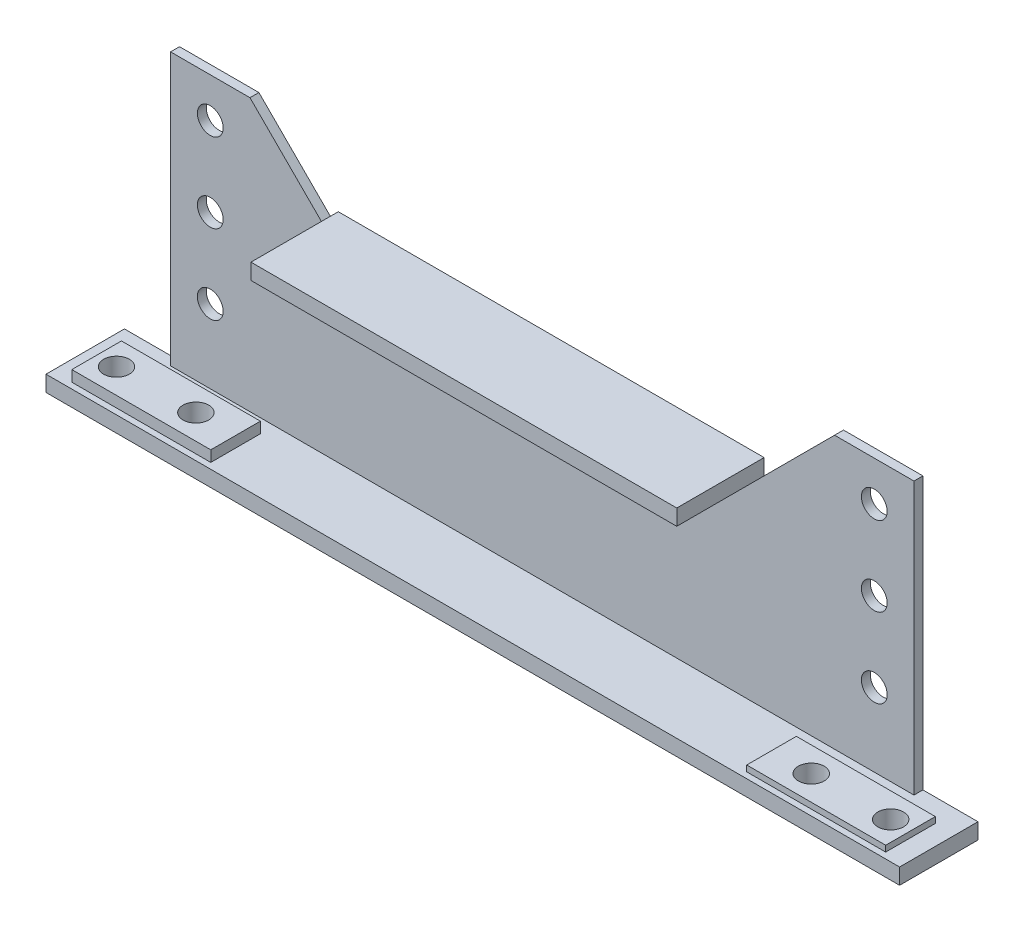
ISO-10303-21;
HEADER;
FILE_DESCRIPTION(('STEP AP214'),'2;1');
FILE_NAME('part.step','',(''),(''),'','','');
FILE_SCHEMA(('AUTOMOTIVE_DESIGN { 1 0 10303 214 1 1 1 1 }'));
ENDSEC;
DATA;
#1=APPLICATION_CONTEXT('core data for automotive mechanical design processes');
#2=APPLICATION_PROTOCOL_DEFINITION('international standard','automotive_design',2000,#1);
#3=PRODUCT_CONTEXT('',#1,'mechanical');
#4=PRODUCT('Part','Part','',(#3));
#5=PRODUCT_RELATED_PRODUCT_CATEGORY('part','',(#4));
#6=PRODUCT_DEFINITION_FORMATION('','',#4);
#7=PRODUCT_DEFINITION_CONTEXT('part definition',#1,'design');
#8=PRODUCT_DEFINITION('design','',#6,#7);
#9=PRODUCT_DEFINITION_SHAPE('','',#8);
#10=(LENGTH_UNIT() NAMED_UNIT(*) SI_UNIT(.MILLI.,.METRE.));
#11=(NAMED_UNIT(*) PLANE_ANGLE_UNIT() SI_UNIT($,.RADIAN.));
#12=(NAMED_UNIT(*) SI_UNIT($,.STERADIAN.) SOLID_ANGLE_UNIT());
#13=UNCERTAINTY_MEASURE_WITH_UNIT(LENGTH_MEASURE(1.E-05),#10,'distance_accuracy_value','');
#14=(GEOMETRIC_REPRESENTATION_CONTEXT(3) GLOBAL_UNCERTAINTY_ASSIGNED_CONTEXT((#13)) GLOBAL_UNIT_ASSIGNED_CONTEXT((#10,
#11,#12)) REPRESENTATION_CONTEXT('',''));
#15=CARTESIAN_POINT('',(0.,0.,0.));
#16=DIRECTION('',(0.,0.,1.));
#17=DIRECTION('',(1.,0.,0.));
#18=AXIS2_PLACEMENT_3D('',#15,#16,#17);
#19=CARTESIAN_POINT('',(0.,15.9999999999956,9.));
#20=DIRECTION('',(0.,0.,-1.));
#21=DIRECTION('',(-1.,0.,0.));
#22=AXIS2_PLACEMENT_3D('',#19,#20,#21);
#23=PLANE('',#22);
#24=CARTESIAN_POINT('',(764.499999999999,169.999999999994,9.));
#25=DIRECTION('',(0.,0.,1.));
#26=DIRECTION('',(1.,0.,0.));
#27=AXIS2_PLACEMENT_3D('',#24,#25,#26);
#28=CIRCLE('',#27,13.);
#29=CARTESIAN_POINT('',(777.499999999999,169.999999999994,9.));
#30=VERTEX_POINT('',#29);
#31=EDGE_CURVE('E325',#30,#30,#28,.T.);
#32=ORIENTED_EDGE('',*,*,#31,.F.);
#33=EDGE_LOOP('',(#32));
#34=FACE_BOUND('',#33,.T.);
#35=CARTESIAN_POINT('',(95.4999999999935,250.,9.));
#36=DIRECTION('',(0.,0.,1.));
#37=DIRECTION('',(1.,0.,0.));
#38=AXIS2_PLACEMENT_3D('',#35,#36,#37);
#39=CIRCLE('',#38,13.);
#40=CARTESIAN_POINT('',(108.499999999994,250.,9.));
#41=VERTEX_POINT('',#40);
#42=EDGE_CURVE('E337',#41,#41,#39,.T.);
#43=ORIENTED_EDGE('',*,*,#42,.F.);
#44=EDGE_LOOP('',(#43));
#45=FACE_BOUND('',#44,.T.);
#46=CARTESIAN_POINT('',(95.4999999999935,90.0000000000017,9.));
#47=DIRECTION('',(0.,0.,1.));
#48=DIRECTION('',(1.,0.,0.));
#49=AXIS2_PLACEMENT_3D('',#46,#47,#48);
#50=CIRCLE('',#49,13.);
#51=CARTESIAN_POINT('',(108.499999999994,90.0000000000017,9.));
#52=VERTEX_POINT('',#51);
#53=EDGE_CURVE('E349',#52,#52,#50,.T.);
#54=ORIENTED_EDGE('',*,*,#53,.F.);
#55=EDGE_LOOP('',(#54));
#56=FACE_BOUND('',#55,.T.);
#57=CARTESIAN_POINT('',(95.4999999999935,169.999999999994,9.));
#58=DIRECTION('',(0.,0.,1.));
#59=DIRECTION('',(1.,0.,0.));
#60=AXIS2_PLACEMENT_3D('',#57,#58,#59);
#61=CIRCLE('',#60,13.);
#62=CARTESIAN_POINT('',(108.499999999994,169.999999999994,9.));
#63=VERTEX_POINT('',#62);
#64=EDGE_CURVE('E343',#63,#63,#61,.T.);
#65=ORIENTED_EDGE('',*,*,#64,.F.);
#66=EDGE_LOOP('',(#65));
#67=FACE_BOUND('',#66,.T.);
#68=CARTESIAN_POINT('',(764.499999999999,90.0000000000017,9.));
#69=DIRECTION('',(0.,0.,1.));
#70=DIRECTION('',(1.,0.,0.));
#71=AXIS2_PLACEMENT_3D('',#68,#69,#70);
#72=CIRCLE('',#71,13.);
#73=CARTESIAN_POINT('',(777.499999999999,90.0000000000017,9.));
#74=VERTEX_POINT('',#73);
#75=EDGE_CURVE('E331',#74,#74,#72,.T.);
#76=ORIENTED_EDGE('',*,*,#75,.F.);
#77=EDGE_LOOP('',(#76));
#78=FACE_BOUND('',#77,.T.);
#79=CARTESIAN_POINT('',(764.499999999999,250.,9.));
#80=DIRECTION('',(0.,0.,1.));
#81=DIRECTION('',(1.,0.,0.));
#82=AXIS2_PLACEMENT_3D('',#79,#80,#81);
#83=CIRCLE('',#82,13.);
#84=CARTESIAN_POINT('',(777.499999999999,250.,9.));
#85=VERTEX_POINT('',#84);
#86=EDGE_CURVE('E319',#85,#85,#83,.T.);
#87=ORIENTED_EDGE('',*,*,#86,.F.);
#88=EDGE_LOOP('',(#87));
#89=FACE_BOUND('',#88,.T.);
#90=DIRECTION('',(1.,0.,0.));
#91=VECTOR('',#90,1.);
#92=CARTESIAN_POINT('',(215.5,210.,9.));
#93=LINE('',#92,#91);
#94=CARTESIAN_POINT('',(215.5,210.,9.));
#95=VERTEX_POINT('',#94);
#96=CARTESIAN_POINT('',(644.50000000001,210.,9.));
#97=VERTEX_POINT('',#96);
#98=EDGE_CURVE('E210',#95,#97,#93,.T.);
#99=ORIENTED_EDGE('',*,*,#98,.F.);
#100=DIRECTION('',(-0.707106781186546,0.707106781186549,0.));
#101=VECTOR('',#100,1.);
#102=CARTESIAN_POINT('',(135.5,290.,9.));
#103=LINE('',#102,#101);
#104=CARTESIAN_POINT('',(135.5,290.,9.));
#105=VERTEX_POINT('',#104);
#106=EDGE_CURVE('E360',#95,#105,#103,.T.);
#107=ORIENTED_EDGE('',*,*,#106,.T.);
#108=DIRECTION('',(-1.,0.,0.));
#109=VECTOR('',#108,1.);
#110=CARTESIAN_POINT('',(55.4999999999975,289.999999999996,9.));
#111=LINE('',#110,#109);
#112=CARTESIAN_POINT('',(55.4999999999975,289.999999999996,9.));
#113=VERTEX_POINT('',#112);
#114=EDGE_CURVE('E362',#105,#113,#111,.T.);
#115=ORIENTED_EDGE('',*,*,#114,.T.);
#116=DIRECTION('',(0.,-1.,0.));
#117=VECTOR('',#116,1.);
#118=CARTESIAN_POINT('',(55.4999999999975,15.9999999999956,9.));
#119=LINE('',#118,#117);
#120=CARTESIAN_POINT('',(55.4999999999975,15.9999999999956,9.));
#121=VERTEX_POINT('',#120);
#122=EDGE_CURVE('E364',#113,#121,#119,.T.);
#123=ORIENTED_EDGE('',*,*,#122,.T.);
#124=DIRECTION('',(-1.,0.,0.));
#125=VECTOR('',#124,1.);
#126=CARTESIAN_POINT('',(0.,15.9999999999956,9.));
#127=LINE('',#126,#125);
#128=CARTESIAN_POINT('',(804.499999999995,15.9999999999956,9.));
#129=VERTEX_POINT('',#128);
#130=EDGE_CURVE('E11',#129,#121,#127,.T.);
#131=ORIENTED_EDGE('',*,*,#130,.F.);
#132=DIRECTION('',(0.,1.,0.));
#133=VECTOR('',#132,1.);
#134=CARTESIAN_POINT('',(804.499999999995,15.9999999999956,9.));
#135=LINE('',#134,#133);
#136=CARTESIAN_POINT('',(804.499999999995,289.999999999996,9.));
#137=VERTEX_POINT('',#136);
#138=EDGE_CURVE('E358',#129,#137,#135,.T.);
#139=ORIENTED_EDGE('',*,*,#138,.T.);
#140=DIRECTION('',(-1.,0.,0.));
#141=VECTOR('',#140,1.);
#142=CARTESIAN_POINT('',(804.499999999995,289.999999999996,9.));
#143=LINE('',#142,#141);
#144=CARTESIAN_POINT('',(724.5,290.,9.));
#145=VERTEX_POINT('',#144);
#146=EDGE_CURVE('E355',#137,#145,#143,.T.);
#147=ORIENTED_EDGE('',*,*,#146,.T.);
#148=DIRECTION('',(-0.707106781186501,-0.707106781186594,0.));
#149=VECTOR('',#148,1.);
#150=CARTESIAN_POINT('',(724.5,290.,9.));
#151=LINE('',#150,#149);
#152=EDGE_CURVE('E357',#145,#97,#151,.T.);
#153=ORIENTED_EDGE('',*,*,#152,.T.);
#154=EDGE_LOOP('',(#99,#107,#115,#123,#131,#139,#147,#153));
#155=FACE_BOUND('',#154,.T.);
#156=ADVANCED_FACE('F34',(#34,#45,#56,#67,#78,#89,#155),#23,.F.);
#157=CARTESIAN_POINT('',(0.,15.9999999999956,9.));
#158=DIRECTION('',(0.,-1.,0.));
#159=DIRECTION('',(0.,0.,-1.));
#160=AXIS2_PLACEMENT_3D('',#157,#158,#159);
#161=PLANE('',#160);
#162=DIRECTION('',(-1.02487462960706E-13,0.,1.));
#163=VECTOR('',#162,1.);
#164=CARTESIAN_POINT('',(20.0000000000051,15.9999999999956,22.9999999999981));
#165=LINE('',#164,#163);
#166=CARTESIAN_POINT('',(20.0000000000051,15.9999999999956,22.9999999999981));
#167=VERTEX_POINT('',#166);
#168=CARTESIAN_POINT('',(20.,15.9999999999956,73.));
#169=VERTEX_POINT('',#168);
#170=EDGE_CURVE('E271',#167,#169,#165,.T.);
#171=ORIENTED_EDGE('',*,*,#170,.F.);
#172=DIRECTION('',(-1.,0.,0.));
#173=VECTOR('',#172,1.);
#174=CARTESIAN_POINT('',(20.0000000000051,15.9999999999956,22.9999999999981));
#175=LINE('',#174,#173);
#176=CARTESIAN_POINT('',(160.,15.9999999999956,23.));
#177=VERTEX_POINT('',#176);
#178=EDGE_CURVE('E278',#177,#167,#175,.T.);
#179=ORIENTED_EDGE('',*,*,#178,.F.);
#180=DIRECTION('',(0.,0.,-1.));
#181=VECTOR('',#180,1.);
#182=CARTESIAN_POINT('',(160.,15.9999999999956,23.));
#183=LINE('',#182,#181);
#184=CARTESIAN_POINT('',(160.,15.9999999999956,73.));
#185=VERTEX_POINT('',#184);
#186=EDGE_CURVE('E290',#185,#177,#183,.T.);
#187=ORIENTED_EDGE('',*,*,#186,.F.);
#188=DIRECTION('',(1.,0.,0.));
#189=VECTOR('',#188,1.);
#190=CARTESIAN_POINT('',(20.,15.9999999999956,73.));
#191=LINE('',#190,#189);
#192=EDGE_CURVE('E287',#169,#185,#191,.T.);
#193=ORIENTED_EDGE('',*,*,#192,.F.);
#194=EDGE_LOOP('',(#171,#179,#187,#193));
#195=FACE_BOUND('',#194,.T.);
#196=DIRECTION('',(-1.,0.,0.));
#197=VECTOR('',#196,1.);
#198=CARTESIAN_POINT('',(0.,15.9999999999956,0.));
#199=LINE('',#198,#197);
#200=CARTESIAN_POINT('',(55.4999999999975,15.9999999999956,0.));
#201=VERTEX_POINT('',#200);
#202=CARTESIAN_POINT('',(0.,15.9999999999956,0.));
#203=VERTEX_POINT('',#202);
#204=EDGE_CURVE('E391',#201,#203,#199,.T.);
#205=ORIENTED_EDGE('',*,*,#204,.T.);
#206=DIRECTION('',(0.,0.,-1.));
#207=VECTOR('',#206,1.);
#208=CARTESIAN_POINT('',(0.,15.9999999999956,9.));
#209=LINE('',#208,#207);
#210=CARTESIAN_POINT('',(0.,15.9999999999956,79.));
#211=VERTEX_POINT('',#210);
#212=EDGE_CURVE('E393',#211,#203,#209,.T.);
#213=ORIENTED_EDGE('',*,*,#212,.F.);
#214=DIRECTION('',(-1.,0.,0.));
#215=VECTOR('',#214,1.);
#216=CARTESIAN_POINT('',(0.,15.9999999999956,79.));
#217=LINE('',#216,#215);
#218=CARTESIAN_POINT('',(859.999999999992,15.9999999999956,79.));
#219=VERTEX_POINT('',#218);
#220=EDGE_CURVE('E315',#219,#211,#217,.T.);
#221=ORIENTED_EDGE('',*,*,#220,.F.);
#222=DIRECTION('',(0.,0.,-1.));
#223=VECTOR('',#222,1.);
#224=CARTESIAN_POINT('',(859.999999999992,15.9999999999956,9.));
#225=LINE('',#224,#223);
#226=CARTESIAN_POINT('',(859.999999999992,15.9999999999956,0.));
#227=VERTEX_POINT('',#226);
#228=EDGE_CURVE('E419',#219,#227,#225,.T.);
#229=ORIENTED_EDGE('',*,*,#228,.T.);
#230=DIRECTION('',(-1.,0.,0.));
#231=VECTOR('',#230,1.);
#232=CARTESIAN_POINT('',(859.999999999992,15.9999999999956,0.));
#233=LINE('',#232,#231);
#234=CARTESIAN_POINT('',(804.499999999995,15.9999999999956,0.));
#235=VERTEX_POINT('',#234);
#236=EDGE_CURVE('E371',#227,#235,#233,.T.);
#237=ORIENTED_EDGE('',*,*,#236,.T.);
#238=DIRECTION('',(0.,0.,-1.));
#239=VECTOR('',#238,1.);
#240=CARTESIAN_POINT('',(804.499999999995,15.9999999999956,9.));
#241=LINE('',#240,#239);
#242=EDGE_CURVE('E418',#129,#235,#241,.T.);
#243=ORIENTED_EDGE('',*,*,#242,.F.);
#244=ORIENTED_EDGE('',*,*,#130,.T.);
#245=DIRECTION('',(0.,0.,-1.));
#246=VECTOR('',#245,1.);
#247=CARTESIAN_POINT('',(55.4999999999975,15.9999999999956,9.));
#248=LINE('',#247,#246);
#249=EDGE_CURVE('E396',#121,#201,#248,.T.);
#250=ORIENTED_EDGE('',*,*,#249,.T.);
#251=EDGE_LOOP('',(#205,#213,#221,#229,#237,#243,#244,#250));
#252=FACE_BOUND('',#251,.T.);
#253=DIRECTION('',(1.06581410364011E-13,0.,-1.));
#254=VECTOR('',#253,1.);
#255=CARTESIAN_POINT('',(839.999999999998,15.9999999999956,22.9999999999981));
#256=LINE('',#255,#254);
#257=CARTESIAN_POINT('',(839.999999999993,15.9999999999956,73.));
#258=VERTEX_POINT('',#257);
#259=CARTESIAN_POINT('',(839.999999999998,15.9999999999956,22.9999999999981));
#260=VERTEX_POINT('',#259);
#261=EDGE_CURVE('E231',#258,#260,#256,.T.);
#262=ORIENTED_EDGE('',*,*,#261,.F.);
#263=DIRECTION('',(1.,0.,0.));
#264=VECTOR('',#263,1.);
#265=CARTESIAN_POINT('',(839.999999999993,15.9999999999956,73.));
#266=LINE('',#265,#264);
#267=CARTESIAN_POINT('',(699.999999999993,15.9999999999956,73.));
#268=VERTEX_POINT('',#267);
#269=EDGE_CURVE('E238',#268,#258,#266,.T.);
#270=ORIENTED_EDGE('',*,*,#269,.F.);
#271=DIRECTION('',(0.,0.,1.));
#272=VECTOR('',#271,1.);
#273=CARTESIAN_POINT('',(699.999999999992,15.9999999999956,23.));
#274=LINE('',#273,#272);
#275=CARTESIAN_POINT('',(699.999999999992,15.9999999999956,23.));
#276=VERTEX_POINT('',#275);
#277=EDGE_CURVE('E56',#276,#268,#274,.T.);
#278=ORIENTED_EDGE('',*,*,#277,.F.);
#279=DIRECTION('',(-1.,0.,0.));
#280=VECTOR('',#279,1.);
#281=CARTESIAN_POINT('',(839.999999999998,15.9999999999956,22.9999999999981));
#282=LINE('',#281,#280);
#283=EDGE_CURVE('E51',#260,#276,#282,.T.);
#284=ORIENTED_EDGE('',*,*,#283,.F.);
#285=EDGE_LOOP('',(#262,#270,#278,#284));
#286=FACE_BOUND('',#285,.T.);
#287=ADVANCED_FACE('F484',(#195,#252,#286),#161,.F.);
#288=CARTESIAN_POINT('',(0.,15.9999999999956,0.));
#289=DIRECTION('',(0.,0.,-1.));
#290=DIRECTION('',(-1.,0.,0.));
#291=AXIS2_PLACEMENT_3D('',#288,#289,#290);
#292=PLANE('',#291);
#293=CARTESIAN_POINT('',(764.499999999999,169.999999999994,0.));
#294=DIRECTION('',(0.,0.,1.));
#295=DIRECTION('',(1.,0.,0.));
#296=AXIS2_PLACEMENT_3D('',#293,#294,#295);
#297=CIRCLE('',#296,13.);
#298=CARTESIAN_POINT('',(777.499999999999,169.999999999994,0.));
#299=VERTEX_POINT('',#298);
#300=EDGE_CURVE('E322',#299,#299,#297,.T.);
#301=ORIENTED_EDGE('',*,*,#300,.T.);
#302=EDGE_LOOP('',(#301));
#303=FACE_BOUND('',#302,.T.);
#304=CARTESIAN_POINT('',(95.4999999999935,250.,0.));
#305=DIRECTION('',(0.,0.,1.));
#306=DIRECTION('',(1.,0.,0.));
#307=AXIS2_PLACEMENT_3D('',#304,#305,#306);
#308=CIRCLE('',#307,13.);
#309=CARTESIAN_POINT('',(108.499999999994,250.,0.));
#310=VERTEX_POINT('',#309);
#311=EDGE_CURVE('E334',#310,#310,#308,.T.);
#312=ORIENTED_EDGE('',*,*,#311,.T.);
#313=EDGE_LOOP('',(#312));
#314=FACE_BOUND('',#313,.T.);
#315=CARTESIAN_POINT('',(95.4999999999935,90.0000000000017,0.));
#316=DIRECTION('',(0.,0.,1.));
#317=DIRECTION('',(1.,0.,0.));
#318=AXIS2_PLACEMENT_3D('',#315,#316,#317);
#319=CIRCLE('',#318,13.);
#320=CARTESIAN_POINT('',(108.499999999994,90.0000000000017,0.));
#321=VERTEX_POINT('',#320);
#322=EDGE_CURVE('E346',#321,#321,#319,.T.);
#323=ORIENTED_EDGE('',*,*,#322,.T.);
#324=EDGE_LOOP('',(#323));
#325=FACE_BOUND('',#324,.T.);
#326=DIRECTION('',(0.,-1.,0.));
#327=VECTOR('',#326,1.);
#328=CARTESIAN_POINT('',(0.,0.,0.));
#329=LINE('',#328,#327);
#330=CARTESIAN_POINT('',(0.,0.,0.));
#331=VERTEX_POINT('',#330);
#332=EDGE_CURVE('E352',#203,#331,#329,.T.);
#333=ORIENTED_EDGE('',*,*,#332,.F.);
#334=ORIENTED_EDGE('',*,*,#204,.F.);
#335=DIRECTION('',(0.,-1.,0.));
#336=VECTOR('',#335,1.);
#337=CARTESIAN_POINT('',(55.4999999999975,15.9999999999956,0.));
#338=LINE('',#337,#336);
#339=CARTESIAN_POINT('',(55.4999999999975,289.999999999996,0.));
#340=VERTEX_POINT('',#339);
#341=EDGE_CURVE('E389',#340,#201,#338,.T.);
#342=ORIENTED_EDGE('',*,*,#341,.F.);
#343=DIRECTION('',(-1.,0.,0.));
#344=VECTOR('',#343,1.);
#345=CARTESIAN_POINT('',(55.4999999999975,289.999999999996,0.));
#346=LINE('',#345,#344);
#347=CARTESIAN_POINT('',(135.5,290.,0.));
#348=VERTEX_POINT('',#347);
#349=EDGE_CURVE('E387',#348,#340,#346,.T.);
#350=ORIENTED_EDGE('',*,*,#349,.F.);
#351=DIRECTION('',(-0.707106781186546,0.707106781186549,0.));
#352=VECTOR('',#351,1.);
#353=CARTESIAN_POINT('',(135.5,290.,0.));
#354=LINE('',#353,#352);
#355=CARTESIAN_POINT('',(215.5,210.,0.));
#356=VERTEX_POINT('',#355);
#357=EDGE_CURVE('E385',#356,#348,#354,.T.);
#358=ORIENTED_EDGE('',*,*,#357,.F.);
#359=DIRECTION('',(0.,-1.,0.));
#360=VECTOR('',#359,1.);
#361=CARTESIAN_POINT('',(215.5,210.,0.));
#362=LINE('',#361,#360);
#363=CARTESIAN_POINT('',(215.5,226.,0.));
#364=VERTEX_POINT('',#363);
#365=EDGE_CURVE('E383',#364,#356,#362,.T.);
#366=ORIENTED_EDGE('',*,*,#365,.F.);
#367=DIRECTION('',(-1.,0.,0.));
#368=VECTOR('',#367,1.);
#369=CARTESIAN_POINT('',(215.5,226.,0.));
#370=LINE('',#369,#368);
#371=CARTESIAN_POINT('',(644.50000000001,226.,0.));
#372=VERTEX_POINT('',#371);
#373=EDGE_CURVE('E381',#372,#364,#370,.T.);
#374=ORIENTED_EDGE('',*,*,#373,.F.);
#375=DIRECTION('',(0.,1.,0.));
#376=VECTOR('',#375,1.);
#377=CARTESIAN_POINT('',(644.50000000001,210.,0.));
#378=LINE('',#377,#376);
#379=CARTESIAN_POINT('',(644.50000000001,210.,0.));
#380=VERTEX_POINT('',#379);
#381=EDGE_CURVE('E379',#380,#372,#378,.T.);
#382=ORIENTED_EDGE('',*,*,#381,.F.);
#383=DIRECTION('',(-0.707106781186501,-0.707106781186594,0.));
#384=VECTOR('',#383,1.);
#385=CARTESIAN_POINT('',(724.5,290.,0.));
#386=LINE('',#385,#384);
#387=CARTESIAN_POINT('',(724.5,290.,0.));
#388=VERTEX_POINT('',#387);
#389=EDGE_CURVE('E377',#388,#380,#386,.T.);
#390=ORIENTED_EDGE('',*,*,#389,.F.);
#391=DIRECTION('',(-1.,0.,0.));
#392=VECTOR('',#391,1.);
#393=CARTESIAN_POINT('',(804.499999999995,289.999999999996,0.));
#394=LINE('',#393,#392);
#395=CARTESIAN_POINT('',(804.499999999995,289.999999999996,0.));
#396=VERTEX_POINT('',#395);
#397=EDGE_CURVE('E375',#396,#388,#394,.T.);
#398=ORIENTED_EDGE('',*,*,#397,.F.);
#399=DIRECTION('',(0.,1.,0.));
#400=VECTOR('',#399,1.);
#401=CARTESIAN_POINT('',(804.499999999995,15.9999999999956,0.));
#402=LINE('',#401,#400);
#403=EDGE_CURVE('E373',#235,#396,#402,.T.);
#404=ORIENTED_EDGE('',*,*,#403,.F.);
#405=ORIENTED_EDGE('',*,*,#236,.F.);
#406=DIRECTION('',(-4.64905891561913E-13,1.,0.));
#407=VECTOR('',#406,1.);
#408=CARTESIAN_POINT('',(860.,0.,0.));
#409=LINE('',#408,#407);
#410=CARTESIAN_POINT('',(860.,0.,0.));
#411=VERTEX_POINT('',#410);
#412=EDGE_CURVE('E369',#411,#227,#409,.T.);
#413=ORIENTED_EDGE('',*,*,#412,.F.);
#414=DIRECTION('',(1.,0.,0.));
#415=VECTOR('',#414,1.);
#416=CARTESIAN_POINT('',(0.,0.,0.));
#417=LINE('',#416,#415);
#418=EDGE_CURVE('E367',#331,#411,#417,.T.);
#419=ORIENTED_EDGE('',*,*,#418,.F.);
#420=EDGE_LOOP('',(#333,#334,#342,#350,#358,#366,#374,#382,#390,#398,#404,#405,#413,#419));
#421=FACE_BOUND('',#420,.T.);
#422=CARTESIAN_POINT('',(95.4999999999935,169.999999999994,0.));
#423=DIRECTION('',(0.,0.,1.));
#424=DIRECTION('',(1.,0.,0.));
#425=AXIS2_PLACEMENT_3D('',#422,#423,#424);
#426=CIRCLE('',#425,13.);
#427=CARTESIAN_POINT('',(108.499999999994,169.999999999994,0.));
#428=VERTEX_POINT('',#427);
#429=EDGE_CURVE('E340',#428,#428,#426,.T.);
#430=ORIENTED_EDGE('',*,*,#429,.T.);
#431=EDGE_LOOP('',(#430));
#432=FACE_BOUND('',#431,.T.);
#433=CARTESIAN_POINT('',(764.499999999999,90.0000000000017,0.));
#434=DIRECTION('',(0.,0.,1.));
#435=DIRECTION('',(1.,0.,0.));
#436=AXIS2_PLACEMENT_3D('',#433,#434,#435);
#437=CIRCLE('',#436,13.);
#438=CARTESIAN_POINT('',(777.499999999999,90.0000000000017,0.));
#439=VERTEX_POINT('',#438);
#440=EDGE_CURVE('E328',#439,#439,#437,.T.);
#441=ORIENTED_EDGE('',*,*,#440,.T.);
#442=EDGE_LOOP('',(#441));
#443=FACE_BOUND('',#442,.T.);
#444=CARTESIAN_POINT('',(764.499999999999,250.,0.));
#445=DIRECTION('',(0.,0.,1.));
#446=DIRECTION('',(1.,0.,0.));
#447=AXIS2_PLACEMENT_3D('',#444,#445,#446);
#448=CIRCLE('',#447,13.);
#449=CARTESIAN_POINT('',(777.499999999999,250.,0.));
#450=VERTEX_POINT('',#449);
#451=EDGE_CURVE('E318',#450,#450,#448,.T.);
#452=ORIENTED_EDGE('',*,*,#451,.T.);
#453=EDGE_LOOP('',(#452));
#454=FACE_BOUND('',#453,.T.);
#455=ADVANCED_FACE('F467',(#303,#314,#325,#421,#432,#443,#454),#292,.T.);
#456=CARTESIAN_POINT('',(0.,0.,9.));
#457=DIRECTION('',(1.,0.,0.));
#458=DIRECTION('',(0.,1.,0.));
#459=AXIS2_PLACEMENT_3D('',#456,#457,#458);
#460=PLANE('',#459);
#461=ORIENTED_EDGE('',*,*,#332,.T.);
#462=DIRECTION('',(0.,0.,-1.));
#463=VECTOR('',#462,1.);
#464=CARTESIAN_POINT('',(0.,0.,9.));
#465=LINE('',#464,#463);
#466=CARTESIAN_POINT('',(0.,0.,79.));
#467=VERTEX_POINT('',#466);
#468=EDGE_CURVE('E43',#467,#331,#465,.T.);
#469=ORIENTED_EDGE('',*,*,#468,.F.);
#470=DIRECTION('',(0.,-1.,0.));
#471=VECTOR('',#470,1.);
#472=CARTESIAN_POINT('',(0.,0.,79.));
#473=LINE('',#472,#471);
#474=EDGE_CURVE('E306',#211,#467,#473,.T.);
#475=ORIENTED_EDGE('',*,*,#474,.F.);
#476=ORIENTED_EDGE('',*,*,#212,.T.);
#477=EDGE_LOOP('',(#461,#469,#475,#476));
#478=FACE_BOUND('',#477,.T.);
#479=ADVANCED_FACE('F36',(#478),#460,.F.);
#480=CARTESIAN_POINT('',(0.,0.,9.));
#481=DIRECTION('',(0.,1.,0.));
#482=DIRECTION('',(0.,0.,1.));
#483=AXIS2_PLACEMENT_3D('',#480,#481,#482);
#484=PLANE('',#483);
#485=CARTESIAN_POINT('',(739.999999999993,0.,48.000000000002));
#486=DIRECTION('',(0.,1.,0.));
#487=DIRECTION('',(0.,0.,1.));
#488=AXIS2_PLACEMENT_3D('',#485,#486,#487);
#489=CIRCLE('',#488,13.);
#490=CARTESIAN_POINT('',(739.999999999993,0.,61.0000000000021));
#491=VERTEX_POINT('',#490);
#492=EDGE_CURVE('E220',#491,#491,#489,.T.);
#493=ORIENTED_EDGE('',*,*,#492,.T.);
#494=EDGE_LOOP('',(#493));
#495=FACE_BOUND('',#494,.T.);
#496=CARTESIAN_POINT('',(819.999999999993,0.,48.0000000000009));
#497=DIRECTION('',(0.,1.,0.));
#498=DIRECTION('',(0.,0.,1.));
#499=AXIS2_PLACEMENT_3D('',#496,#497,#498);
#500=CIRCLE('',#499,13.);
#501=CARTESIAN_POINT('',(819.999999999993,0.,61.0000000000009));
#502=VERTEX_POINT('',#501);
#503=EDGE_CURVE('E228',#502,#502,#500,.T.);
#504=ORIENTED_EDGE('',*,*,#503,.T.);
#505=EDGE_LOOP('',(#504));
#506=FACE_BOUND('',#505,.T.);
#507=CARTESIAN_POINT('',(119.999999999996,0.,48.000000000002));
#508=DIRECTION('',(0.,1.,0.));
#509=DIRECTION('',(0.,0.,1.));
#510=AXIS2_PLACEMENT_3D('',#507,#508,#509);
#511=CIRCLE('',#510,13.);
#512=CARTESIAN_POINT('',(119.999999999996,0.,61.000000000002));
#513=VERTEX_POINT('',#512);
#514=EDGE_CURVE('E262',#513,#513,#511,.T.);
#515=ORIENTED_EDGE('',*,*,#514,.T.);
#516=EDGE_LOOP('',(#515));
#517=FACE_BOUND('',#516,.T.);
#518=CARTESIAN_POINT('',(39.999999999996,0.,48.0000000000009));
#519=DIRECTION('',(0.,1.,0.));
#520=DIRECTION('',(0.,0.,1.));
#521=AXIS2_PLACEMENT_3D('',#518,#519,#520);
#522=CIRCLE('',#521,13.);
#523=CARTESIAN_POINT('',(39.999999999996,0.,61.0000000000009));
#524=VERTEX_POINT('',#523);
#525=EDGE_CURVE('E268',#524,#524,#522,.T.);
#526=ORIENTED_EDGE('',*,*,#525,.T.);
#527=EDGE_LOOP('',(#526));
#528=FACE_BOUND('',#527,.T.);
#529=ORIENTED_EDGE('',*,*,#418,.T.);
#530=DIRECTION('',(0.,0.,-1.));
#531=VECTOR('',#530,1.);
#532=CARTESIAN_POINT('',(860.,0.,9.));
#533=LINE('',#532,#531);
#534=CARTESIAN_POINT('',(860.,0.,79.));
#535=VERTEX_POINT('',#534);
#536=EDGE_CURVE('E422',#535,#411,#533,.T.);
#537=ORIENTED_EDGE('',*,*,#536,.F.);
#538=DIRECTION('',(1.,0.,0.));
#539=VECTOR('',#538,1.);
#540=CARTESIAN_POINT('',(0.,0.,79.));
#541=LINE('',#540,#539);
#542=EDGE_CURVE('E309',#467,#535,#541,.T.);
#543=ORIENTED_EDGE('',*,*,#542,.F.);
#544=ORIENTED_EDGE('',*,*,#468,.T.);
#545=EDGE_LOOP('',(#529,#537,#543,#544));
#546=FACE_BOUND('',#545,.T.);
#547=ADVANCED_FACE('F779',(#495,#506,#517,#528,#546),#484,.F.);
#548=CARTESIAN_POINT('',(860.,0.,9.));
#549=DIRECTION('',(-1.,-4.64905891561913E-13,0.));
#550=DIRECTION('',(4.64905891561913E-13,-1.,0.));
#551=AXIS2_PLACEMENT_3D('',#548,#549,#550);
#552=PLANE('',#551);
#553=ORIENTED_EDGE('',*,*,#412,.T.);
#554=ORIENTED_EDGE('',*,*,#228,.F.);
#555=DIRECTION('',(-4.64905891561913E-13,1.,0.));
#556=VECTOR('',#555,1.);
#557=CARTESIAN_POINT('',(859.999999999992,15.9999999999956,79.));
#558=LINE('',#557,#556);
#559=EDGE_CURVE('E312',#535,#219,#558,.T.);
#560=ORIENTED_EDGE('',*,*,#559,.F.);
#561=ORIENTED_EDGE('',*,*,#536,.T.);
#562=EDGE_LOOP('',(#553,#554,#560,#561));
#563=FACE_BOUND('',#562,.T.);
#564=ADVANCED_FACE('F786',(#563),#552,.F.);
#565=CARTESIAN_POINT('',(804.499999999995,15.9999999999956,9.));
#566=DIRECTION('',(-1.,0.,0.));
#567=DIRECTION('',(0.,0.,1.));
#568=AXIS2_PLACEMENT_3D('',#565,#566,#567);
#569=PLANE('',#568);
#570=ORIENTED_EDGE('',*,*,#403,.T.);
#571=DIRECTION('',(0.,0.,-1.));
#572=VECTOR('',#571,1.);
#573=CARTESIAN_POINT('',(804.499999999995,289.999999999996,9.));
#574=LINE('',#573,#572);
#575=EDGE_CURVE('E415',#137,#396,#574,.T.);
#576=ORIENTED_EDGE('',*,*,#575,.F.);
#577=ORIENTED_EDGE('',*,*,#138,.F.);
#578=ORIENTED_EDGE('',*,*,#242,.T.);
#579=EDGE_LOOP('',(#570,#576,#577,#578));
#580=FACE_BOUND('',#579,.T.);
#581=ADVANCED_FACE('F446',(#580),#569,.F.);
#582=CARTESIAN_POINT('',(804.499999999995,289.999999999996,9.));
#583=DIRECTION('',(0.,-1.,0.));
#584=DIRECTION('',(1.,0.,0.));
#585=AXIS2_PLACEMENT_3D('',#582,#583,#584);
#586=PLANE('',#585);
#587=ORIENTED_EDGE('',*,*,#397,.T.);
#588=DIRECTION('',(0.,0.,-1.));
#589=VECTOR('',#588,1.);
#590=CARTESIAN_POINT('',(724.5,290.,9.));
#591=LINE('',#590,#589);
#592=EDGE_CURVE('E412',#145,#388,#591,.T.);
#593=ORIENTED_EDGE('',*,*,#592,.F.);
#594=ORIENTED_EDGE('',*,*,#146,.F.);
#595=ORIENTED_EDGE('',*,*,#575,.T.);
#596=EDGE_LOOP('',(#587,#593,#594,#595));
#597=FACE_BOUND('',#596,.T.);
#598=ADVANCED_FACE('F450',(#597),#586,.F.);
#599=CARTESIAN_POINT('',(724.5,290.,9.));
#600=DIRECTION('',(0.707106781186594,-0.707106781186501,0.));
#601=DIRECTION('',(0.707106781186501,0.707106781186594,0.));
#602=AXIS2_PLACEMENT_3D('',#599,#600,#601);
#603=PLANE('',#602);
#604=ORIENTED_EDGE('',*,*,#389,.T.);
#605=DIRECTION('',(0.,0.,-1.));
#606=VECTOR('',#605,1.);
#607=CARTESIAN_POINT('',(644.50000000001,210.,9.));
#608=LINE('',#607,#606);
#609=EDGE_CURVE('E409',#97,#380,#608,.T.);
#610=ORIENTED_EDGE('',*,*,#609,.F.);
#611=ORIENTED_EDGE('',*,*,#152,.F.);
#612=ORIENTED_EDGE('',*,*,#592,.T.);
#613=EDGE_LOOP('',(#604,#610,#611,#612));
#614=FACE_BOUND('',#613,.T.);
#615=ADVANCED_FACE('F455',(#614),#603,.F.);
#616=CARTESIAN_POINT('',(644.50000000001,210.,9.));
#617=DIRECTION('',(-1.,0.,0.));
#618=DIRECTION('',(0.,0.,1.));
#619=AXIS2_PLACEMENT_3D('',#616,#617,#618);
#620=PLANE('',#619);
#621=ORIENTED_EDGE('',*,*,#381,.T.);
#622=DIRECTION('',(0.,0.,-1.));
#623=VECTOR('',#622,1.);
#624=CARTESIAN_POINT('',(644.50000000001,226.,9.));
#625=LINE('',#624,#623);
#626=CARTESIAN_POINT('',(644.5,226.,88.));
#627=VERTEX_POINT('',#626);
#628=EDGE_CURVE('E406',#627,#372,#625,.T.);
#629=ORIENTED_EDGE('',*,*,#628,.F.);
#630=DIRECTION('',(0.,1.,0.));
#631=VECTOR('',#630,1.);
#632=CARTESIAN_POINT('',(644.5,226.,88.));
#633=LINE('',#632,#631);
#634=CARTESIAN_POINT('',(644.5,210.,88.));
#635=VERTEX_POINT('',#634);
#636=EDGE_CURVE('E200',#635,#627,#633,.T.);
#637=ORIENTED_EDGE('',*,*,#636,.F.);
#638=DIRECTION('',(0.,0.,-1.));
#639=VECTOR('',#638,1.);
#640=CARTESIAN_POINT('',(644.5,210.,88.));
#641=LINE('',#640,#639);
#642=EDGE_CURVE('E196',#635,#97,#641,.T.);
#643=ORIENTED_EDGE('',*,*,#642,.T.);
#644=ORIENTED_EDGE('',*,*,#609,.T.);
#645=EDGE_LOOP('',(#621,#629,#637,#643,#644));
#646=FACE_BOUND('',#645,.T.);
#647=ADVANCED_FACE('F487',(#646),#620,.F.);
#648=CARTESIAN_POINT('',(215.5,226.,9.));
#649=DIRECTION('',(0.,-1.,0.));
#650=DIRECTION('',(0.,0.,-1.));
#651=AXIS2_PLACEMENT_3D('',#648,#649,#650);
#652=PLANE('',#651);
#653=ORIENTED_EDGE('',*,*,#373,.T.);
#654=DIRECTION('',(0.,0.,-1.));
#655=VECTOR('',#654,1.);
#656=CARTESIAN_POINT('',(215.5,226.,9.));
#657=LINE('',#656,#655);
#658=CARTESIAN_POINT('',(215.5,226.,88.));
#659=VERTEX_POINT('',#658);
#660=EDGE_CURVE('E404',#659,#364,#657,.T.);
#661=ORIENTED_EDGE('',*,*,#660,.F.);
#662=DIRECTION('',(-1.,0.,0.));
#663=VECTOR('',#662,1.);
#664=CARTESIAN_POINT('',(215.5,226.,88.));
#665=LINE('',#664,#663);
#666=EDGE_CURVE('E207',#627,#659,#665,.T.);
#667=ORIENTED_EDGE('',*,*,#666,.F.);
#668=ORIENTED_EDGE('',*,*,#628,.T.);
#669=EDGE_LOOP('',(#653,#661,#667,#668));
#670=FACE_BOUND('',#669,.T.);
#671=ADVANCED_FACE('F461',(#670),#652,.F.);
#672=CARTESIAN_POINT('',(215.5,210.,9.));
#673=DIRECTION('',(1.,0.,0.));
#674=DIRECTION('',(0.,1.,0.));
#675=AXIS2_PLACEMENT_3D('',#672,#673,#674);
#676=PLANE('',#675);
#677=ORIENTED_EDGE('',*,*,#365,.T.);
#678=DIRECTION('',(0.,0.,-1.));
#679=VECTOR('',#678,1.);
#680=CARTESIAN_POINT('',(215.5,210.,9.));
#681=LINE('',#680,#679);
#682=EDGE_CURVE('E215',#95,#356,#681,.T.);
#683=ORIENTED_EDGE('',*,*,#682,.F.);
#684=DIRECTION('',(0.,0.,-1.));
#685=VECTOR('',#684,1.);
#686=CARTESIAN_POINT('',(215.5,210.,88.));
#687=LINE('',#686,#685);
#688=CARTESIAN_POINT('',(215.5,210.,88.));
#689=VERTEX_POINT('',#688);
#690=EDGE_CURVE('E194',#689,#95,#687,.T.);
#691=ORIENTED_EDGE('',*,*,#690,.F.);
#692=DIRECTION('',(0.,-1.,0.));
#693=VECTOR('',#692,1.);
#694=CARTESIAN_POINT('',(215.5,226.,88.));
#695=LINE('',#694,#693);
#696=EDGE_CURVE('E201',#659,#689,#695,.T.);
#697=ORIENTED_EDGE('',*,*,#696,.F.);
#698=ORIENTED_EDGE('',*,*,#660,.T.);
#699=EDGE_LOOP('',(#677,#683,#691,#697,#698));
#700=FACE_BOUND('',#699,.T.);
#701=ADVANCED_FACE('F213',(#700),#676,.F.);
#702=CARTESIAN_POINT('',(135.5,290.,9.));
#703=DIRECTION('',(-0.707106781186549,-0.707106781186546,0.));
#704=DIRECTION('',(0.707106781186546,-0.707106781186549,0.));
#705=AXIS2_PLACEMENT_3D('',#702,#703,#704);
#706=PLANE('',#705);
#707=ORIENTED_EDGE('',*,*,#357,.T.);
#708=DIRECTION('',(0.,0.,-1.));
#709=VECTOR('',#708,1.);
#710=CARTESIAN_POINT('',(135.5,290.,9.));
#711=LINE('',#710,#709);
#712=EDGE_CURVE('E400',#105,#348,#711,.T.);
#713=ORIENTED_EDGE('',*,*,#712,.F.);
#714=ORIENTED_EDGE('',*,*,#106,.F.);
#715=ORIENTED_EDGE('',*,*,#682,.T.);
#716=EDGE_LOOP('',(#707,#713,#714,#715));
#717=FACE_BOUND('',#716,.T.);
#718=ADVANCED_FACE('F473',(#717),#706,.F.);
#719=CARTESIAN_POINT('',(55.4999999999975,289.999999999996,9.));
#720=DIRECTION('',(0.,-1.,0.));
#721=DIRECTION('',(1.,0.,0.));
#722=AXIS2_PLACEMENT_3D('',#719,#720,#721);
#723=PLANE('',#722);
#724=ORIENTED_EDGE('',*,*,#349,.T.);
#725=DIRECTION('',(0.,0.,-1.));
#726=VECTOR('',#725,1.);
#727=CARTESIAN_POINT('',(55.4999999999975,289.999999999996,9.));
#728=LINE('',#727,#726);
#729=EDGE_CURVE('E397',#113,#340,#728,.T.);
#730=ORIENTED_EDGE('',*,*,#729,.F.);
#731=ORIENTED_EDGE('',*,*,#114,.F.);
#732=ORIENTED_EDGE('',*,*,#712,.T.);
#733=EDGE_LOOP('',(#724,#730,#731,#732));
#734=FACE_BOUND('',#733,.T.);
#735=ADVANCED_FACE('F476',(#734),#723,.F.);
#736=CARTESIAN_POINT('',(55.4999999999975,15.9999999999956,9.));
#737=DIRECTION('',(1.,0.,0.));
#738=DIRECTION('',(0.,0.,-1.));
#739=AXIS2_PLACEMENT_3D('',#736,#737,#738);
#740=PLANE('',#739);
#741=ORIENTED_EDGE('',*,*,#341,.T.);
#742=ORIENTED_EDGE('',*,*,#249,.F.);
#743=ORIENTED_EDGE('',*,*,#122,.F.);
#744=ORIENTED_EDGE('',*,*,#729,.T.);
#745=EDGE_LOOP('',(#741,#742,#743,#744));
#746=FACE_BOUND('',#745,.T.);
#747=ADVANCED_FACE('F481',(#746),#740,.F.);
#748=CARTESIAN_POINT('',(95.4999999999935,90.0000000000017,9.));
#749=DIRECTION('',(0.,0.,-1.));
#750=DIRECTION('',(-1.,0.,0.));
#751=AXIS2_PLACEMENT_3D('',#748,#749,#750);
#752=CYLINDRICAL_SURFACE('',#751,13.);
#753=ORIENTED_EDGE('',*,*,#53,.T.);
#754=EDGE_LOOP('',(#753));
#755=FACE_BOUND('',#754,.T.);
#756=ORIENTED_EDGE('',*,*,#322,.F.);
#757=EDGE_LOOP('',(#756));
#758=FACE_BOUND('',#757,.T.);
#759=ADVANCED_FACE('F508',(#755,#758),#752,.F.);
#760=CARTESIAN_POINT('',(95.4999999999935,169.999999999994,9.));
#761=DIRECTION('',(0.,0.,-1.));
#762=DIRECTION('',(-1.,0.,0.));
#763=AXIS2_PLACEMENT_3D('',#760,#761,#762);
#764=CYLINDRICAL_SURFACE('',#763,13.);
#765=ORIENTED_EDGE('',*,*,#64,.T.);
#766=EDGE_LOOP('',(#765));
#767=FACE_BOUND('',#766,.T.);
#768=ORIENTED_EDGE('',*,*,#429,.F.);
#769=EDGE_LOOP('',(#768));
#770=FACE_BOUND('',#769,.T.);
#771=ADVANCED_FACE('F546',(#767,#770),#764,.F.);
#772=CARTESIAN_POINT('',(95.4999999999935,250.,9.));
#773=DIRECTION('',(0.,0.,-1.));
#774=DIRECTION('',(-1.,0.,0.));
#775=AXIS2_PLACEMENT_3D('',#772,#773,#774);
#776=CYLINDRICAL_SURFACE('',#775,13.);
#777=ORIENTED_EDGE('',*,*,#42,.T.);
#778=EDGE_LOOP('',(#777));
#779=FACE_BOUND('',#778,.T.);
#780=ORIENTED_EDGE('',*,*,#311,.F.);
#781=EDGE_LOOP('',(#780));
#782=FACE_BOUND('',#781,.T.);
#783=ADVANCED_FACE('F553',(#779,#782),#776,.F.);
#784=CARTESIAN_POINT('',(764.499999999999,90.0000000000017,9.));
#785=DIRECTION('',(0.,0.,-1.));
#786=DIRECTION('',(-1.,0.,0.));
#787=AXIS2_PLACEMENT_3D('',#784,#785,#786);
#788=CYLINDRICAL_SURFACE('',#787,13.);
#789=ORIENTED_EDGE('',*,*,#75,.T.);
#790=EDGE_LOOP('',(#789));
#791=FACE_BOUND('',#790,.T.);
#792=ORIENTED_EDGE('',*,*,#440,.F.);
#793=EDGE_LOOP('',(#792));
#794=FACE_BOUND('',#793,.T.);
#795=ADVANCED_FACE('F560',(#791,#794),#788,.F.);
#796=CARTESIAN_POINT('',(764.499999999999,169.999999999994,9.));
#797=DIRECTION('',(0.,0.,-1.));
#798=DIRECTION('',(-1.,0.,0.));
#799=AXIS2_PLACEMENT_3D('',#796,#797,#798);
#800=CYLINDRICAL_SURFACE('',#799,13.);
#801=ORIENTED_EDGE('',*,*,#31,.T.);
#802=EDGE_LOOP('',(#801));
#803=FACE_BOUND('',#802,.T.);
#804=ORIENTED_EDGE('',*,*,#300,.F.);
#805=EDGE_LOOP('',(#804));
#806=FACE_BOUND('',#805,.T.);
#807=ADVANCED_FACE('F568',(#803,#806),#800,.F.);
#808=CARTESIAN_POINT('',(764.499999999999,250.,9.));
#809=DIRECTION('',(0.,0.,-1.));
#810=DIRECTION('',(-1.,0.,0.));
#811=AXIS2_PLACEMENT_3D('',#808,#809,#810);
#812=CYLINDRICAL_SURFACE('',#811,13.);
#813=ORIENTED_EDGE('',*,*,#86,.T.);
#814=EDGE_LOOP('',(#813));
#815=FACE_BOUND('',#814,.T.);
#816=ORIENTED_EDGE('',*,*,#451,.F.);
#817=EDGE_LOOP('',(#816));
#818=FACE_BOUND('',#817,.T.);
#819=ADVANCED_FACE('F576',(#815,#818),#812,.F.);
#820=CARTESIAN_POINT('',(0.,15.9999999999956,79.));
#821=DIRECTION('',(0.,0.,-1.));
#822=DIRECTION('',(-1.,0.,0.));
#823=AXIS2_PLACEMENT_3D('',#820,#821,#822);
#824=PLANE('',#823);
#825=ORIENTED_EDGE('',*,*,#474,.T.);
#826=ORIENTED_EDGE('',*,*,#542,.T.);
#827=ORIENTED_EDGE('',*,*,#559,.T.);
#828=ORIENTED_EDGE('',*,*,#220,.T.);
#829=EDGE_LOOP('',(#825,#826,#827,#828));
#830=FACE_BOUND('',#829,.T.);
#831=ADVANCED_FACE('F584',(#830),#824,.F.);
#832=CARTESIAN_POINT('',(20.0000000000051,26.9999999999956,22.9999999999981));
#833=DIRECTION('',(1.,0.,1.02487462960706E-13));
#834=DIRECTION('',(1.02487462960706E-13,0.,-1.));
#835=AXIS2_PLACEMENT_3D('',#832,#833,#834);
#836=PLANE('',#835);
#837=ORIENTED_EDGE('',*,*,#170,.T.);
#838=DIRECTION('',(0.,-1.,0.));
#839=VECTOR('',#838,1.);
#840=CARTESIAN_POINT('',(20.,26.9999999999956,73.));
#841=LINE('',#840,#839);
#842=CARTESIAN_POINT('',(20.,26.9999999999956,73.));
#843=VERTEX_POINT('',#842);
#844=EDGE_CURVE('E303',#843,#169,#841,.T.);
#845=ORIENTED_EDGE('',*,*,#844,.F.);
#846=DIRECTION('',(-1.02487462960706E-13,0.,1.));
#847=VECTOR('',#846,1.);
#848=CARTESIAN_POINT('',(20.0000000000051,26.9999999999956,22.9999999999981));
#849=LINE('',#848,#847);
#850=CARTESIAN_POINT('',(20.0000000000051,26.9999999999956,22.9999999999981));
#851=VERTEX_POINT('',#850);
#852=EDGE_CURVE('E274',#851,#843,#849,.T.);
#853=ORIENTED_EDGE('',*,*,#852,.F.);
#854=DIRECTION('',(0.,-1.,0.));
#855=VECTOR('',#854,1.);
#856=CARTESIAN_POINT('',(20.0000000000051,26.9999999999956,22.9999999999981));
#857=LINE('',#856,#855);
#858=EDGE_CURVE('E284',#851,#167,#857,.T.);
#859=ORIENTED_EDGE('',*,*,#858,.T.);
#860=EDGE_LOOP('',(#837,#845,#853,#859));
#861=FACE_BOUND('',#860,.T.);
#862=ADVANCED_FACE('F592',(#861),#836,.F.);
#863=CARTESIAN_POINT('',(20.,26.9999999999956,73.));
#864=DIRECTION('',(0.,0.,-1.));
#865=DIRECTION('',(-1.,0.,0.));
#866=AXIS2_PLACEMENT_3D('',#863,#864,#865);
#867=PLANE('',#866);
#868=ORIENTED_EDGE('',*,*,#192,.T.);
#869=DIRECTION('',(0.,-1.,0.));
#870=VECTOR('',#869,1.);
#871=CARTESIAN_POINT('',(160.,26.9999999999956,73.));
#872=LINE('',#871,#870);
#873=CARTESIAN_POINT('',(160.,26.9999999999956,73.));
#874=VERTEX_POINT('',#873);
#875=EDGE_CURVE('E300',#874,#185,#872,.T.);
#876=ORIENTED_EDGE('',*,*,#875,.F.);
#877=DIRECTION('',(1.,0.,0.));
#878=VECTOR('',#877,1.);
#879=CARTESIAN_POINT('',(20.,26.9999999999956,73.));
#880=LINE('',#879,#878);
#881=EDGE_CURVE('E277',#843,#874,#880,.T.);
#882=ORIENTED_EDGE('',*,*,#881,.F.);
#883=ORIENTED_EDGE('',*,*,#844,.T.);
#884=EDGE_LOOP('',(#868,#876,#882,#883));
#885=FACE_BOUND('',#884,.T.);
#886=ADVANCED_FACE('F600',(#885),#867,.F.);
#887=CARTESIAN_POINT('',(160.,26.9999999999956,23.));
#888=DIRECTION('',(-1.,0.,0.));
#889=DIRECTION('',(0.,0.,1.));
#890=AXIS2_PLACEMENT_3D('',#887,#888,#889);
#891=PLANE('',#890);
#892=ORIENTED_EDGE('',*,*,#186,.T.);
#893=DIRECTION('',(0.,-1.,0.));
#894=VECTOR('',#893,1.);
#895=CARTESIAN_POINT('',(160.,26.9999999999956,23.));
#896=LINE('',#895,#894);
#897=CARTESIAN_POINT('',(160.,26.9999999999956,23.));
#898=VERTEX_POINT('',#897);
#899=EDGE_CURVE('E297',#898,#177,#896,.T.);
#900=ORIENTED_EDGE('',*,*,#899,.F.);
#901=DIRECTION('',(0.,0.,-1.));
#902=VECTOR('',#901,1.);
#903=CARTESIAN_POINT('',(160.,26.9999999999956,23.));
#904=LINE('',#903,#902);
#905=EDGE_CURVE('E280',#874,#898,#904,.T.);
#906=ORIENTED_EDGE('',*,*,#905,.F.);
#907=ORIENTED_EDGE('',*,*,#875,.T.);
#908=EDGE_LOOP('',(#892,#900,#906,#907));
#909=FACE_BOUND('',#908,.T.);
#910=ADVANCED_FACE('F608',(#909),#891,.F.);
#911=CARTESIAN_POINT('',(20.0000000000051,26.9999999999956,22.9999999999981));
#912=DIRECTION('',(0.,0.,1.));
#913=DIRECTION('',(1.,0.,0.));
#914=AXIS2_PLACEMENT_3D('',#911,#912,#913);
#915=PLANE('',#914);
#916=ORIENTED_EDGE('',*,*,#178,.T.);
#917=ORIENTED_EDGE('',*,*,#858,.F.);
#918=DIRECTION('',(-1.,0.,0.));
#919=VECTOR('',#918,1.);
#920=CARTESIAN_POINT('',(20.0000000000051,26.9999999999956,22.9999999999981));
#921=LINE('',#920,#919);
#922=EDGE_CURVE('E282',#898,#851,#921,.T.);
#923=ORIENTED_EDGE('',*,*,#922,.F.);
#924=ORIENTED_EDGE('',*,*,#899,.T.);
#925=EDGE_LOOP('',(#916,#917,#923,#924));
#926=FACE_BOUND('',#925,.T.);
#927=ADVANCED_FACE('F616',(#926),#915,.F.);
#928=CARTESIAN_POINT('',(20.,26.9999999999956,73.));
#929=DIRECTION('',(0.,1.,0.));
#930=DIRECTION('',(0.,0.,1.));
#931=AXIS2_PLACEMENT_3D('',#928,#929,#930);
#932=PLANE('',#931);
#933=CARTESIAN_POINT('',(119.999999999996,26.9999999999956,48.000000000002));
#934=DIRECTION('',(0.,1.,0.));
#935=DIRECTION('',(0.,0.,1.));
#936=AXIS2_PLACEMENT_3D('',#933,#934,#935);
#937=CIRCLE('',#936,13.);
#938=CARTESIAN_POINT('',(119.999999999996,26.9999999999956,61.000000000002));
#939=VERTEX_POINT('',#938);
#940=EDGE_CURVE('E261',#939,#939,#937,.T.);
#941=ORIENTED_EDGE('',*,*,#940,.F.);
#942=EDGE_LOOP('',(#941));
#943=FACE_BOUND('',#942,.T.);
#944=CARTESIAN_POINT('',(39.999999999996,26.9999999999956,48.0000000000009));
#945=DIRECTION('',(0.,1.,0.));
#946=DIRECTION('',(0.,0.,1.));
#947=AXIS2_PLACEMENT_3D('',#944,#945,#946);
#948=CIRCLE('',#947,13.);
#949=CARTESIAN_POINT('',(39.999999999996,26.9999999999956,61.0000000000009));
#950=VERTEX_POINT('',#949);
#951=EDGE_CURVE('E265',#950,#950,#948,.T.);
#952=ORIENTED_EDGE('',*,*,#951,.F.);
#953=EDGE_LOOP('',(#952));
#954=FACE_BOUND('',#953,.T.);
#955=ORIENTED_EDGE('',*,*,#852,.T.);
#956=ORIENTED_EDGE('',*,*,#881,.T.);
#957=ORIENTED_EDGE('',*,*,#905,.T.);
#958=ORIENTED_EDGE('',*,*,#922,.T.);
#959=EDGE_LOOP('',(#955,#956,#957,#958));
#960=FACE_BOUND('',#959,.T.);
#961=ADVANCED_FACE('F624',(#943,#954,#960),#932,.T.);
#962=CARTESIAN_POINT('',(39.999999999996,0.,48.0000000000009));
#963=DIRECTION('',(0.,1.,0.));
#964=DIRECTION('',(0.,0.,1.));
#965=AXIS2_PLACEMENT_3D('',#962,#963,#964);
#966=CYLINDRICAL_SURFACE('',#965,13.);
#967=ORIENTED_EDGE('',*,*,#525,.F.);
#968=EDGE_LOOP('',(#967));
#969=FACE_BOUND('',#968,.T.);
#970=ORIENTED_EDGE('',*,*,#951,.T.);
#971=EDGE_LOOP('',(#970));
#972=FACE_BOUND('',#971,.T.);
#973=ADVANCED_FACE('F633',(#969,#972),#966,.F.);
#974=CARTESIAN_POINT('',(119.999999999996,0.,48.000000000002));
#975=DIRECTION('',(0.,1.,0.));
#976=DIRECTION('',(0.,0.,1.));
#977=AXIS2_PLACEMENT_3D('',#974,#975,#976);
#978=CYLINDRICAL_SURFACE('',#977,13.);
#979=ORIENTED_EDGE('',*,*,#514,.F.);
#980=EDGE_LOOP('',(#979));
#981=FACE_BOUND('',#980,.T.);
#982=ORIENTED_EDGE('',*,*,#940,.T.);
#983=EDGE_LOOP('',(#982));
#984=FACE_BOUND('',#983,.T.);
#985=ADVANCED_FACE('F641',(#981,#984),#978,.F.);
#986=CARTESIAN_POINT('',(839.999999999998,21.9999999999956,22.9999999999981));
#987=DIRECTION('',(-1.,0.,-1.06581410364011E-13));
#988=DIRECTION('',(-1.06581410364011E-13,0.,1.));
#989=AXIS2_PLACEMENT_3D('',#986,#987,#988);
#990=PLANE('',#989);
#991=ORIENTED_EDGE('',*,*,#261,.T.);
#992=DIRECTION('',(0.,-1.,0.));
#993=VECTOR('',#992,1.);
#994=CARTESIAN_POINT('',(839.999999999998,21.9999999999956,22.9999999999981));
#995=LINE('',#994,#993);
#996=CARTESIAN_POINT('',(839.999999999998,21.9999999999956,22.9999999999981));
#997=VERTEX_POINT('',#996);
#998=EDGE_CURVE('E259',#997,#260,#995,.T.);
#999=ORIENTED_EDGE('',*,*,#998,.F.);
#1000=DIRECTION('',(1.06581410364011E-13,0.,-1.));
#1001=VECTOR('',#1000,1.);
#1002=CARTESIAN_POINT('',(839.999999999998,21.9999999999956,22.9999999999981));
#1003=LINE('',#1002,#1001);
#1004=CARTESIAN_POINT('',(839.999999999993,21.9999999999956,73.));
#1005=VERTEX_POINT('',#1004);
#1006=EDGE_CURVE('E234',#1005,#997,#1003,.T.);
#1007=ORIENTED_EDGE('',*,*,#1006,.F.);
#1008=DIRECTION('',(0.,-1.,0.));
#1009=VECTOR('',#1008,1.);
#1010=CARTESIAN_POINT('',(839.999999999993,21.9999999999956,73.));
#1011=LINE('',#1010,#1009);
#1012=EDGE_CURVE('E244',#1005,#258,#1011,.T.);
#1013=ORIENTED_EDGE('',*,*,#1012,.T.);
#1014=EDGE_LOOP('',(#991,#999,#1007,#1013));
#1015=FACE_BOUND('',#1014,.T.);
#1016=ADVANCED_FACE('F648',(#1015),#990,.F.);
#1017=CARTESIAN_POINT('',(839.999999999998,21.9999999999956,22.9999999999981));
#1018=DIRECTION('',(0.,0.,1.));
#1019=DIRECTION('',(1.,0.,0.));
#1020=AXIS2_PLACEMENT_3D('',#1017,#1018,#1019);
#1021=PLANE('',#1020);
#1022=ORIENTED_EDGE('',*,*,#283,.T.);
#1023=DIRECTION('',(0.,-1.,0.));
#1024=VECTOR('',#1023,1.);
#1025=CARTESIAN_POINT('',(699.999999999992,21.9999999999956,23.));
#1026=LINE('',#1025,#1024);
#1027=CARTESIAN_POINT('',(699.999999999992,21.9999999999956,23.));
#1028=VERTEX_POINT('',#1027);
#1029=EDGE_CURVE('E256',#1028,#276,#1026,.T.);
#1030=ORIENTED_EDGE('',*,*,#1029,.F.);
#1031=DIRECTION('',(-1.,0.,0.));
#1032=VECTOR('',#1031,1.);
#1033=CARTESIAN_POINT('',(839.999999999998,21.9999999999956,22.9999999999981));
#1034=LINE('',#1033,#1032);
#1035=EDGE_CURVE('E237',#997,#1028,#1034,.T.);
#1036=ORIENTED_EDGE('',*,*,#1035,.F.);
#1037=ORIENTED_EDGE('',*,*,#998,.T.);
#1038=EDGE_LOOP('',(#1022,#1030,#1036,#1037));
#1039=FACE_BOUND('',#1038,.T.);
#1040=ADVANCED_FACE('F657',(#1039),#1021,.F.);
#1041=CARTESIAN_POINT('',(699.999999999992,21.9999999999956,23.));
#1042=DIRECTION('',(1.,0.,0.));
#1043=DIRECTION('',(0.,0.,-1.));
#1044=AXIS2_PLACEMENT_3D('',#1041,#1042,#1043);
#1045=PLANE('',#1044);
#1046=ORIENTED_EDGE('',*,*,#277,.T.);
#1047=DIRECTION('',(0.,-1.,0.));
#1048=VECTOR('',#1047,1.);
#1049=CARTESIAN_POINT('',(699.999999999993,21.9999999999956,73.));
#1050=LINE('',#1049,#1048);
#1051=CARTESIAN_POINT('',(699.999999999993,21.9999999999956,73.));
#1052=VERTEX_POINT('',#1051);
#1053=EDGE_CURVE('E253',#1052,#268,#1050,.T.);
#1054=ORIENTED_EDGE('',*,*,#1053,.F.);
#1055=DIRECTION('',(0.,0.,1.));
#1056=VECTOR('',#1055,1.);
#1057=CARTESIAN_POINT('',(699.999999999992,21.9999999999956,23.));
#1058=LINE('',#1057,#1056);
#1059=EDGE_CURVE('E240',#1028,#1052,#1058,.T.);
#1060=ORIENTED_EDGE('',*,*,#1059,.F.);
#1061=ORIENTED_EDGE('',*,*,#1029,.T.);
#1062=EDGE_LOOP('',(#1046,#1054,#1060,#1061));
#1063=FACE_BOUND('',#1062,.T.);
#1064=ADVANCED_FACE('F665',(#1063),#1045,.F.);
#1065=CARTESIAN_POINT('',(839.999999999993,21.9999999999956,73.));
#1066=DIRECTION('',(0.,0.,-1.));
#1067=DIRECTION('',(-1.,0.,0.));
#1068=AXIS2_PLACEMENT_3D('',#1065,#1066,#1067);
#1069=PLANE('',#1068);
#1070=ORIENTED_EDGE('',*,*,#269,.T.);
#1071=ORIENTED_EDGE('',*,*,#1012,.F.);
#1072=DIRECTION('',(1.,0.,0.));
#1073=VECTOR('',#1072,1.);
#1074=CARTESIAN_POINT('',(839.999999999993,21.9999999999956,73.));
#1075=LINE('',#1074,#1073);
#1076=EDGE_CURVE('E242',#1052,#1005,#1075,.T.);
#1077=ORIENTED_EDGE('',*,*,#1076,.F.);
#1078=ORIENTED_EDGE('',*,*,#1053,.T.);
#1079=EDGE_LOOP('',(#1070,#1071,#1077,#1078));
#1080=FACE_BOUND('',#1079,.T.);
#1081=ADVANCED_FACE('F673',(#1080),#1069,.F.);
#1082=CARTESIAN_POINT('',(839.999999999993,21.9999999999956,73.));
#1083=DIRECTION('',(0.,-1.,0.));
#1084=DIRECTION('',(0.,0.,-1.));
#1085=AXIS2_PLACEMENT_3D('',#1082,#1083,#1084);
#1086=PLANE('',#1085);
#1087=CARTESIAN_POINT('',(739.999999999993,21.9999999999956,48.000000000002));
#1088=DIRECTION('',(0.,1.,0.));
#1089=DIRECTION('',(0.,0.,1.));
#1090=AXIS2_PLACEMENT_3D('',#1087,#1088,#1089);
#1091=CIRCLE('',#1090,13.);
#1092=CARTESIAN_POINT('',(739.999999999993,21.9999999999956,61.0000000000021));
#1093=VERTEX_POINT('',#1092);
#1094=EDGE_CURVE('E217',#1093,#1093,#1091,.T.);
#1095=ORIENTED_EDGE('',*,*,#1094,.F.);
#1096=EDGE_LOOP('',(#1095));
#1097=FACE_BOUND('',#1096,.T.);
#1098=CARTESIAN_POINT('',(819.999999999993,21.9999999999956,48.0000000000009));
#1099=DIRECTION('',(0.,1.,0.));
#1100=DIRECTION('',(0.,0.,1.));
#1101=AXIS2_PLACEMENT_3D('',#1098,#1099,#1100);
#1102=CIRCLE('',#1101,13.);
#1103=CARTESIAN_POINT('',(819.999999999993,21.9999999999956,61.0000000000009));
#1104=VERTEX_POINT('',#1103);
#1105=EDGE_CURVE('E226',#1104,#1104,#1102,.T.);
#1106=ORIENTED_EDGE('',*,*,#1105,.F.);
#1107=EDGE_LOOP('',(#1106));
#1108=FACE_BOUND('',#1107,.T.);
#1109=ORIENTED_EDGE('',*,*,#1006,.T.);
#1110=ORIENTED_EDGE('',*,*,#1035,.T.);
#1111=ORIENTED_EDGE('',*,*,#1059,.T.);
#1112=ORIENTED_EDGE('',*,*,#1076,.T.);
#1113=EDGE_LOOP('',(#1109,#1110,#1111,#1112));
#1114=FACE_BOUND('',#1113,.T.);
#1115=ADVANCED_FACE('F681',(#1097,#1108,#1114),#1086,.F.);
#1116=CARTESIAN_POINT('',(819.999999999993,0.,48.0000000000009));
#1117=DIRECTION('',(0.,1.,0.));
#1118=DIRECTION('',(0.,0.,1.));
#1119=AXIS2_PLACEMENT_3D('',#1116,#1117,#1118);
#1120=CYLINDRICAL_SURFACE('',#1119,13.);
#1121=ORIENTED_EDGE('',*,*,#503,.F.);
#1122=EDGE_LOOP('',(#1121));
#1123=FACE_BOUND('',#1122,.T.);
#1124=ORIENTED_EDGE('',*,*,#1105,.T.);
#1125=EDGE_LOOP('',(#1124));
#1126=FACE_BOUND('',#1125,.T.);
#1127=ADVANCED_FACE('F690',(#1123,#1126),#1120,.F.);
#1128=CARTESIAN_POINT('',(739.999999999993,0.,48.000000000002));
#1129=DIRECTION('',(0.,1.,0.));
#1130=DIRECTION('',(0.,0.,1.));
#1131=AXIS2_PLACEMENT_3D('',#1128,#1129,#1130);
#1132=CYLINDRICAL_SURFACE('',#1131,13.);
#1133=ORIENTED_EDGE('',*,*,#492,.F.);
#1134=EDGE_LOOP('',(#1133));
#1135=FACE_BOUND('',#1134,.T.);
#1136=ORIENTED_EDGE('',*,*,#1094,.T.);
#1137=EDGE_LOOP('',(#1136));
#1138=FACE_BOUND('',#1137,.T.);
#1139=ADVANCED_FACE('F699',(#1135,#1138),#1132,.F.);
#1140=CARTESIAN_POINT('',(215.5,210.,88.));
#1141=DIRECTION('',(0.,1.,0.));
#1142=DIRECTION('',(0.,0.,1.));
#1143=AXIS2_PLACEMENT_3D('',#1140,#1141,#1142);
#1144=PLANE('',#1143);
#1145=ORIENTED_EDGE('',*,*,#98,.T.);
#1146=ORIENTED_EDGE('',*,*,#642,.F.);
#1147=DIRECTION('',(1.,0.,0.));
#1148=VECTOR('',#1147,1.);
#1149=CARTESIAN_POINT('',(215.5,210.,88.));
#1150=LINE('',#1149,#1148);
#1151=EDGE_CURVE('E189',#689,#635,#1150,.T.);
#1152=ORIENTED_EDGE('',*,*,#1151,.F.);
#1153=ORIENTED_EDGE('',*,*,#690,.T.);
#1154=EDGE_LOOP('',(#1145,#1146,#1152,#1153));
#1155=FACE_BOUND('',#1154,.T.);
#1156=ADVANCED_FACE('F192',(#1155),#1144,.F.);
#1157=CARTESIAN_POINT('',(215.5,210.,88.));
#1158=DIRECTION('',(0.,0.,1.));
#1159=DIRECTION('',(1.,0.,0.));
#1160=AXIS2_PLACEMENT_3D('',#1157,#1158,#1159);
#1161=PLANE('',#1160);
#1162=ORIENTED_EDGE('',*,*,#696,.T.);
#1163=ORIENTED_EDGE('',*,*,#1151,.T.);
#1164=ORIENTED_EDGE('',*,*,#636,.T.);
#1165=ORIENTED_EDGE('',*,*,#666,.T.);
#1166=EDGE_LOOP('',(#1162,#1163,#1164,#1165));
#1167=FACE_BOUND('',#1166,.T.);
#1168=ADVANCED_FACE('F205',(#1167),#1161,.T.);
#1169=CLOSED_SHELL('',(#156,#287,#455,#479,#547,#564,#581,#598,#615,#647,#671,#701,#718,#735,
#747,#759,#771,#783,#795,#807,#819,#831,#862,#886,#910,#927,#961,#973,#985,#1016,#1040,#1064,
#1081,#1115,#1127,#1139,#1156,#1168));
#1170=MANIFOLD_SOLID_BREP('B2',#1169);
#1171=ADVANCED_BREP_SHAPE_REPRESENTATION('',(#18,#1170),#14);
#1172=SHAPE_DEFINITION_REPRESENTATION(#9,#1171);
ENDSEC;
END-ISO-10303-21;
